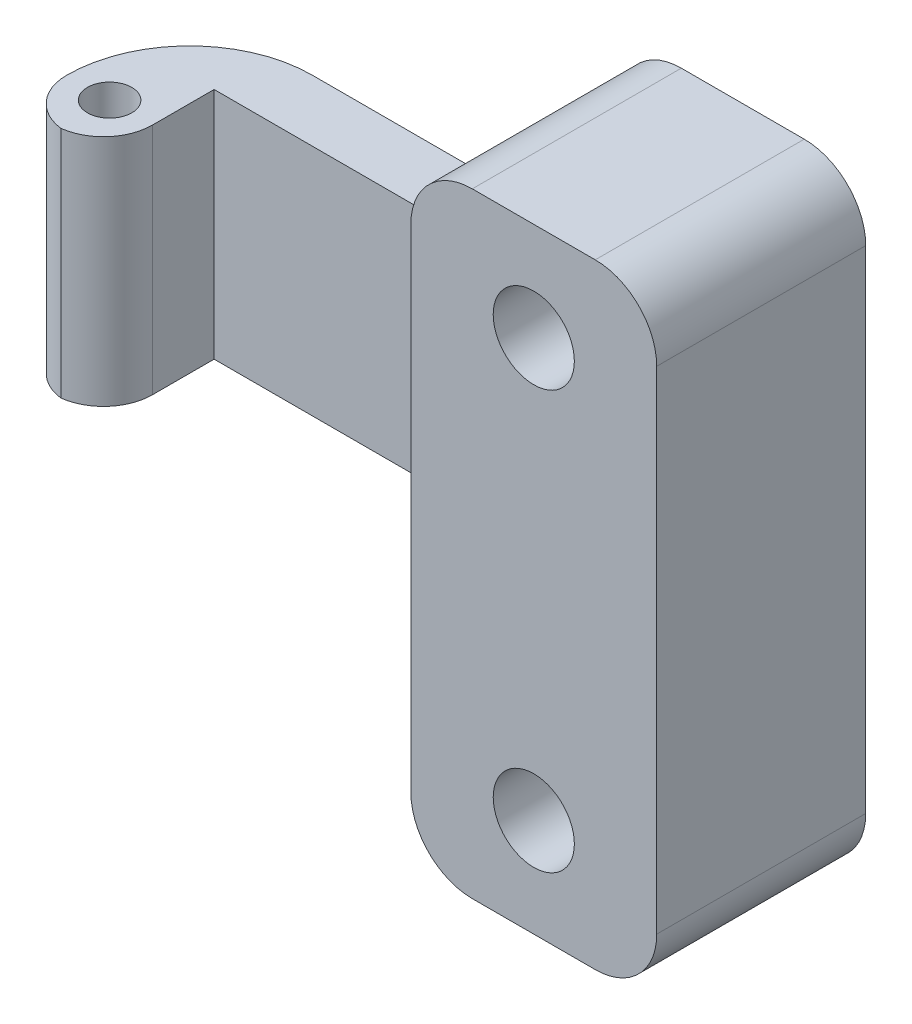
ISO-10303-21;
HEADER;
FILE_DESCRIPTION(('STEP AP214'),'2;1');
FILE_NAME('part.step','',(''),(''),'','','');
FILE_SCHEMA(('AUTOMOTIVE_DESIGN { 1 0 10303 214 1 1 1 1 }'));
ENDSEC;
DATA;
#1=APPLICATION_CONTEXT('core data for automotive mechanical design processes');
#2=APPLICATION_PROTOCOL_DEFINITION('international standard','automotive_design',2000,#1);
#3=PRODUCT_CONTEXT('',#1,'mechanical');
#4=PRODUCT('Part','Part','',(#3));
#5=PRODUCT_RELATED_PRODUCT_CATEGORY('part','',(#4));
#6=PRODUCT_DEFINITION_FORMATION('','',#4);
#7=PRODUCT_DEFINITION_CONTEXT('part definition',#1,'design');
#8=PRODUCT_DEFINITION('design','',#6,#7);
#9=PRODUCT_DEFINITION_SHAPE('','',#8);
#10=(LENGTH_UNIT() NAMED_UNIT(*) SI_UNIT(.MILLI.,.METRE.));
#11=(NAMED_UNIT(*) PLANE_ANGLE_UNIT() SI_UNIT($,.RADIAN.));
#12=(NAMED_UNIT(*) SI_UNIT($,.STERADIAN.) SOLID_ANGLE_UNIT());
#13=UNCERTAINTY_MEASURE_WITH_UNIT(LENGTH_MEASURE(1.E-05),#10,'distance_accuracy_value','');
#14=(GEOMETRIC_REPRESENTATION_CONTEXT(3) GLOBAL_UNCERTAINTY_ASSIGNED_CONTEXT((#13)) GLOBAL_UNIT_ASSIGNED_CONTEXT((#10,
#11,#12)) REPRESENTATION_CONTEXT('',''));
#15=CARTESIAN_POINT('',(0.,0.,0.));
#16=DIRECTION('',(0.,0.,1.));
#17=DIRECTION('',(1.,0.,0.));
#18=AXIS2_PLACEMENT_3D('',#15,#16,#17);
#19=CARTESIAN_POINT('',(0.,0.,5.));
#20=DIRECTION('',(0.,0.,1.));
#21=DIRECTION('',(1.,0.,0.));
#22=AXIS2_PLACEMENT_3D('',#19,#20,#21);
#23=PLANE('',#22);
#24=DIRECTION('',(1.,0.,0.));
#25=VECTOR('',#24,1.);
#26=CARTESIAN_POINT('',(0.,-9.5,5.));
#27=LINE('',#26,#25);
#28=CARTESIAN_POINT('',(-10.5,-9.5,5.));
#29=VERTEX_POINT('',#28);
#30=CARTESIAN_POINT('',(14.5,-9.5,5.));
#31=VERTEX_POINT('',#30);
#32=EDGE_CURVE('E175',#29,#31,#27,.T.);
#33=ORIENTED_EDGE('',*,*,#32,.T.);
#34=CARTESIAN_POINT('',(14.5,-12.5,5.));
#35=DIRECTION('',(0.,0.,1.));
#36=DIRECTION('',(1.,0.,0.));
#37=AXIS2_PLACEMENT_3D('',#34,#35,#36);
#38=CIRCLE('',#37,3.);
#39=CARTESIAN_POINT('',(17.5,-12.5,5.));
#40=VERTEX_POINT('',#39);
#41=EDGE_CURVE('E287',#31,#40,#38,.F.);
#42=ORIENTED_EDGE('',*,*,#41,.T.);
#43=DIRECTION('',(0.,1.,0.));
#44=VECTOR('',#43,1.);
#45=CARTESIAN_POINT('',(17.5,0.,5.));
#46=LINE('',#45,#44);
#47=CARTESIAN_POINT('',(17.5,12.5,5.));
#48=VERTEX_POINT('',#47);
#49=EDGE_CURVE('E211',#40,#48,#46,.T.);
#50=ORIENTED_EDGE('',*,*,#49,.T.);
#51=CARTESIAN_POINT('',(14.5,12.5,5.));
#52=DIRECTION('',(0.,0.,1.));
#53=DIRECTION('',(1.,0.,0.));
#54=AXIS2_PLACEMENT_3D('',#51,#52,#53);
#55=CIRCLE('',#54,3.);
#56=CARTESIAN_POINT('',(14.5,9.5,5.));
#57=VERTEX_POINT('',#56);
#58=EDGE_CURVE('E11',#48,#57,#55,.F.);
#59=ORIENTED_EDGE('',*,*,#58,.T.);
#60=DIRECTION('',(1.,0.,0.));
#61=VECTOR('',#60,1.);
#62=CARTESIAN_POINT('',(0.,9.5,5.));
#63=LINE('',#62,#61);
#64=CARTESIAN_POINT('',(-10.5,9.5,5.));
#65=VERTEX_POINT('',#64);
#66=EDGE_CURVE('E162',#65,#57,#63,.T.);
#67=ORIENTED_EDGE('',*,*,#66,.F.);
#68=DIRECTION('',(0.,1.,0.));
#69=VECTOR('',#68,1.);
#70=CARTESIAN_POINT('',(-10.5,9.5,5.));
#71=LINE('',#70,#69);
#72=EDGE_CURVE('E169',#29,#65,#71,.T.);
#73=ORIENTED_EDGE('',*,*,#72,.F.);
#74=EDGE_LOOP('',(#33,#42,#50,#59,#67,#73));
#75=FACE_BOUND('',#74,.T.);
#76=ADVANCED_FACE('F37',(#75),#23,.T.);
#77=CARTESIAN_POINT('',(0.,-9.5,5.));
#78=DIRECTION('',(0.,1.,0.));
#79=DIRECTION('',(0.,0.,1.));
#80=AXIS2_PLACEMENT_3D('',#77,#78,#79);
#81=PLANE('',#80);
#82=CARTESIAN_POINT('',(-14.,-9.5,10.));
#83=DIRECTION('',(0.,-1.,0.));
#84=DIRECTION('',(0.,0.,-1.));
#85=AXIS2_PLACEMENT_3D('',#82,#83,#84);
#86=CIRCLE('',#85,1.8);
#87=CARTESIAN_POINT('',(-14.,-9.5,8.2));
#88=VERTEX_POINT('',#87);
#89=EDGE_CURVE('E182',#88,#88,#86,.T.);
#90=ORIENTED_EDGE('',*,*,#89,.F.);
#91=EDGE_LOOP('',(#90));
#92=FACE_BOUND('',#91,.T.);
#93=DIRECTION('',(1.,0.,0.));
#94=VECTOR('',#93,1.);
#95=CARTESIAN_POINT('',(0.,-9.5,0.));
#96=LINE('',#95,#94);
#97=CARTESIAN_POINT('',(-7.49999999999999,-9.5,0.));
#98=VERTEX_POINT('',#97);
#99=CARTESIAN_POINT('',(14.5,-9.5,0.));
#100=VERTEX_POINT('',#99);
#101=EDGE_CURVE('E187',#98,#100,#96,.T.);
#102=ORIENTED_EDGE('',*,*,#101,.T.);
#103=DIRECTION('',(0.,0.,-1.));
#104=VECTOR('',#103,1.);
#105=CARTESIAN_POINT('',(14.5,-9.5,5.));
#106=LINE('',#105,#104);
#107=EDGE_CURVE('E281',#100,#31,#106,.F.);
#108=ORIENTED_EDGE('',*,*,#107,.T.);
#109=ORIENTED_EDGE('',*,*,#32,.F.);
#110=DIRECTION('',(0.,0.,-1.));
#111=VECTOR('',#110,1.);
#112=CARTESIAN_POINT('',(-10.5,-9.5,14.));
#113=LINE('',#112,#111);
#114=CARTESIAN_POINT('',(-10.5,-9.5,10.01));
#115=VERTEX_POINT('',#114);
#116=EDGE_CURVE('E168',#115,#29,#113,.T.);
#117=ORIENTED_EDGE('',*,*,#116,.F.);
#118=CARTESIAN_POINT('',(-14.49,-9.5,10.01));
#119=DIRECTION('',(0.,1.,0.));
#120=DIRECTION('',(0.,0.,1.));
#121=AXIS2_PLACEMENT_3D('',#118,#119,#120);
#122=CIRCLE('',#121,3.99);
#123=CARTESIAN_POINT('',(-14.,-9.5,13.9697979746447));
#124=VERTEX_POINT('',#123);
#125=EDGE_CURVE('E213',#115,#124,#122,.F.);
#126=ORIENTED_EDGE('',*,*,#125,.T.);
#127=CARTESIAN_POINT('',(-13.51,-9.5,10.01));
#128=DIRECTION('',(0.,1.,0.));
#129=DIRECTION('',(0.,0.,1.));
#130=AXIS2_PLACEMENT_3D('',#127,#128,#129);
#131=CIRCLE('',#130,3.99);
#132=CARTESIAN_POINT('',(-17.5,-9.5,10.01));
#133=VERTEX_POINT('',#132);
#134=EDGE_CURVE('E215',#124,#133,#131,.F.);
#135=ORIENTED_EDGE('',*,*,#134,.T.);
#136=DIRECTION('',(0.,0.,-1.));
#137=VECTOR('',#136,1.);
#138=CARTESIAN_POINT('',(-17.5,-9.5,5.));
#139=LINE('',#138,#137);
#140=CARTESIAN_POINT('',(-17.5,-9.5,10.));
#141=VERTEX_POINT('',#140);
#142=EDGE_CURVE('E174',#133,#141,#139,.T.);
#143=ORIENTED_EDGE('',*,*,#142,.T.);
#144=CARTESIAN_POINT('',(-7.49999999999999,-9.5,10.));
#145=DIRECTION('',(0.,1.,0.));
#146=DIRECTION('',(0.,0.,1.));
#147=AXIS2_PLACEMENT_3D('',#144,#145,#146);
#148=CIRCLE('',#147,10.);
#149=EDGE_CURVE('E232',#141,#98,#148,.F.);
#150=ORIENTED_EDGE('',*,*,#149,.T.);
#151=EDGE_LOOP('',(#102,#108,#109,#117,#126,#135,#143,#150));
#152=FACE_BOUND('',#151,.T.);
#153=ADVANCED_FACE('F309',(#92,#152),#81,.F.);
#154=CARTESIAN_POINT('',(0.,-25.,5.));
#155=DIRECTION('',(0.,-1.,0.));
#156=DIRECTION('',(1.,0.,0.));
#157=AXIS2_PLACEMENT_3D('',#154,#155,#156);
#158=PLANE('',#157);
#159=DIRECTION('',(-1.,0.,0.));
#160=VECTOR('',#159,1.);
#161=CARTESIAN_POINT('',(0.,-25.,0.));
#162=LINE('',#161,#160);
#163=CARTESIAN_POINT('',(32.5,-25.,0.));
#164=VERTEX_POINT('',#163);
#165=CARTESIAN_POINT('',(22.5,-25.,0.));
#166=VERTEX_POINT('',#165);
#167=EDGE_CURVE('E194',#164,#166,#162,.T.);
#168=ORIENTED_EDGE('',*,*,#167,.F.);
#169=DIRECTION('',(0.,0.,-1.));
#170=VECTOR('',#169,1.);
#171=CARTESIAN_POINT('',(32.5,-25.,5.));
#172=LINE('',#171,#170);
#173=CARTESIAN_POINT('',(32.5,-25.,17.));
#174=VERTEX_POINT('',#173);
#175=EDGE_CURVE('E273',#164,#174,#172,.F.);
#176=ORIENTED_EDGE('',*,*,#175,.T.);
#177=DIRECTION('',(1.,0.,0.));
#178=VECTOR('',#177,1.);
#179=CARTESIAN_POINT('',(17.5,-25.,17.));
#180=LINE('',#179,#178);
#181=CARTESIAN_POINT('',(22.5,-25.,17.));
#182=VERTEX_POINT('',#181);
#183=EDGE_CURVE('E338',#182,#174,#180,.T.);
#184=ORIENTED_EDGE('',*,*,#183,.F.);
#185=DIRECTION('',(0.,0.,-1.));
#186=VECTOR('',#185,1.);
#187=CARTESIAN_POINT('',(22.5,-25.,0.));
#188=LINE('',#187,#186);
#189=EDGE_CURVE('E270',#182,#166,#188,.T.);
#190=ORIENTED_EDGE('',*,*,#189,.T.);
#191=EDGE_LOOP('',(#168,#176,#184,#190));
#192=FACE_BOUND('',#191,.T.);
#193=ADVANCED_FACE('F358',(#192),#158,.T.);
#194=CARTESIAN_POINT('',(37.5,0.,5.));
#195=DIRECTION('',(1.,0.,0.));
#196=DIRECTION('',(0.,0.,-1.));
#197=AXIS2_PLACEMENT_3D('',#194,#195,#196);
#198=PLANE('',#197);
#199=DIRECTION('',(0.,-1.,0.));
#200=VECTOR('',#199,1.);
#201=CARTESIAN_POINT('',(37.5,0.,0.));
#202=LINE('',#201,#200);
#203=CARTESIAN_POINT('',(37.5,20.,0.));
#204=VERTEX_POINT('',#203);
#205=CARTESIAN_POINT('',(37.5,-20.,0.));
#206=VERTEX_POINT('',#205);
#207=EDGE_CURVE('E198',#204,#206,#202,.T.);
#208=ORIENTED_EDGE('',*,*,#207,.F.);
#209=DIRECTION('',(0.,0.,-1.));
#210=VECTOR('',#209,1.);
#211=CARTESIAN_POINT('',(37.5,20.,17.));
#212=LINE('',#211,#210);
#213=CARTESIAN_POINT('',(37.5,20.,17.));
#214=VERTEX_POINT('',#213);
#215=EDGE_CURVE('E268',#204,#214,#212,.F.);
#216=ORIENTED_EDGE('',*,*,#215,.T.);
#217=DIRECTION('',(0.,1.,0.));
#218=VECTOR('',#217,1.);
#219=CARTESIAN_POINT('',(37.5,25.,17.));
#220=LINE('',#219,#218);
#221=CARTESIAN_POINT('',(37.5,-20.,17.));
#222=VERTEX_POINT('',#221);
#223=EDGE_CURVE('E341',#222,#214,#220,.T.);
#224=ORIENTED_EDGE('',*,*,#223,.F.);
#225=DIRECTION('',(0.,0.,-1.));
#226=VECTOR('',#225,1.);
#227=CARTESIAN_POINT('',(37.5,-20.,5.));
#228=LINE('',#227,#226);
#229=EDGE_CURVE('E265',#222,#206,#228,.T.);
#230=ORIENTED_EDGE('',*,*,#229,.T.);
#231=EDGE_LOOP('',(#208,#216,#224,#230));
#232=FACE_BOUND('',#231,.T.);
#233=ADVANCED_FACE('F365',(#232),#198,.T.);
#234=CARTESIAN_POINT('',(0.,25.,5.));
#235=DIRECTION('',(0.,-1.,0.));
#236=DIRECTION('',(1.,0.,0.));
#237=AXIS2_PLACEMENT_3D('',#234,#235,#236);
#238=PLANE('',#237);
#239=DIRECTION('',(-1.,0.,0.));
#240=VECTOR('',#239,1.);
#241=CARTESIAN_POINT('',(0.,25.,0.));
#242=LINE('',#241,#240);
#243=CARTESIAN_POINT('',(32.5,25.,0.));
#244=VERTEX_POINT('',#243);
#245=CARTESIAN_POINT('',(22.5,25.,0.));
#246=VERTEX_POINT('',#245);
#247=EDGE_CURVE('E201',#244,#246,#242,.T.);
#248=ORIENTED_EDGE('',*,*,#247,.T.);
#249=DIRECTION('',(0.,0.,-1.));
#250=VECTOR('',#249,1.);
#251=CARTESIAN_POINT('',(22.5,25.,5.));
#252=LINE('',#251,#250);
#253=CARTESIAN_POINT('',(22.5,25.,17.));
#254=VERTEX_POINT('',#253);
#255=EDGE_CURVE('E255',#246,#254,#252,.F.);
#256=ORIENTED_EDGE('',*,*,#255,.T.);
#257=DIRECTION('',(-1.,0.,0.));
#258=VECTOR('',#257,1.);
#259=CARTESIAN_POINT('',(17.5,25.,17.));
#260=LINE('',#259,#258);
#261=CARTESIAN_POINT('',(32.5,25.,17.));
#262=VERTEX_POINT('',#261);
#263=EDGE_CURVE('E350',#262,#254,#260,.T.);
#264=ORIENTED_EDGE('',*,*,#263,.F.);
#265=DIRECTION('',(0.,0.,-1.));
#266=VECTOR('',#265,1.);
#267=CARTESIAN_POINT('',(32.5,25.,0.));
#268=LINE('',#267,#266);
#269=EDGE_CURVE('E252',#262,#244,#268,.T.);
#270=ORIENTED_EDGE('',*,*,#269,.T.);
#271=EDGE_LOOP('',(#248,#256,#264,#270));
#272=FACE_BOUND('',#271,.T.);
#273=ADVANCED_FACE('F426',(#272),#238,.F.);
#274=CARTESIAN_POINT('',(17.5,0.,5.));
#275=DIRECTION('',(1.,0.,0.));
#276=DIRECTION('',(0.,0.,-1.));
#277=AXIS2_PLACEMENT_3D('',#274,#275,#276);
#278=PLANE('',#277);
#279=ORIENTED_EDGE('',*,*,#49,.F.);
#280=DIRECTION('',(0.,0.,-1.));
#281=VECTOR('',#280,1.);
#282=CARTESIAN_POINT('',(17.5,-12.5,0.));
#283=LINE('',#282,#281);
#284=CARTESIAN_POINT('',(17.5,-12.5,0.));
#285=VERTEX_POINT('',#284);
#286=EDGE_CURVE('E278',#40,#285,#283,.T.);
#287=ORIENTED_EDGE('',*,*,#286,.T.);
#288=DIRECTION('',(0.,-1.,0.));
#289=VECTOR('',#288,1.);
#290=CARTESIAN_POINT('',(17.5,0.,0.));
#291=LINE('',#290,#289);
#292=CARTESIAN_POINT('',(17.5,-20.,0.));
#293=VERTEX_POINT('',#292);
#294=EDGE_CURVE('E192',#285,#293,#291,.T.);
#295=ORIENTED_EDGE('',*,*,#294,.T.);
#296=DIRECTION('',(0.,0.,-1.));
#297=VECTOR('',#296,1.);
#298=CARTESIAN_POINT('',(17.5,-20.,17.));
#299=LINE('',#298,#297);
#300=CARTESIAN_POINT('',(17.5,-20.,17.));
#301=VERTEX_POINT('',#300);
#302=EDGE_CURVE('E238',#293,#301,#299,.F.);
#303=ORIENTED_EDGE('',*,*,#302,.T.);
#304=DIRECTION('',(0.,-1.,0.));
#305=VECTOR('',#304,1.);
#306=CARTESIAN_POINT('',(17.5,25.,17.));
#307=LINE('',#306,#305);
#308=CARTESIAN_POINT('',(17.5,20.,17.));
#309=VERTEX_POINT('',#308);
#310=EDGE_CURVE('E331',#309,#301,#307,.T.);
#311=ORIENTED_EDGE('',*,*,#310,.F.);
#312=DIRECTION('',(0.,0.,-1.));
#313=VECTOR('',#312,1.);
#314=CARTESIAN_POINT('',(17.5,20.,5.));
#315=LINE('',#314,#313);
#316=CARTESIAN_POINT('',(17.5,20.,0.));
#317=VERTEX_POINT('',#316);
#318=EDGE_CURVE('E240',#309,#317,#315,.T.);
#319=ORIENTED_EDGE('',*,*,#318,.T.);
#320=CARTESIAN_POINT('',(17.5,12.5,0.));
#321=VERTEX_POINT('',#320);
#322=EDGE_CURVE('E195',#317,#321,#291,.T.);
#323=ORIENTED_EDGE('',*,*,#322,.T.);
#324=DIRECTION('',(0.,0.,-1.));
#325=VECTOR('',#324,1.);
#326=CARTESIAN_POINT('',(17.5,12.5,5.));
#327=LINE('',#326,#325);
#328=EDGE_CURVE('E275',#321,#48,#327,.F.);
#329=ORIENTED_EDGE('',*,*,#328,.T.);
#330=EDGE_LOOP('',(#279,#287,#295,#303,#311,#319,#323,#329));
#331=FACE_BOUND('',#330,.T.);
#332=ADVANCED_FACE('F295',(#331),#278,.F.);
#333=CARTESIAN_POINT('',(0.,9.5,5.));
#334=DIRECTION('',(0.,1.,0.));
#335=DIRECTION('',(0.,0.,1.));
#336=AXIS2_PLACEMENT_3D('',#333,#334,#335);
#337=PLANE('',#336);
#338=CARTESIAN_POINT('',(-14.,9.5,10.));
#339=DIRECTION('',(0.,1.,0.));
#340=DIRECTION('',(0.,0.,1.));
#341=AXIS2_PLACEMENT_3D('',#338,#339,#340);
#342=CIRCLE('',#341,1.8);
#343=CARTESIAN_POINT('',(-14.,9.5,11.8));
#344=VERTEX_POINT('',#343);
#345=EDGE_CURVE('E179',#344,#344,#342,.T.);
#346=ORIENTED_EDGE('',*,*,#345,.F.);
#347=EDGE_LOOP('',(#346));
#348=FACE_BOUND('',#347,.T.);
#349=ORIENTED_EDGE('',*,*,#66,.T.);
#350=DIRECTION('',(0.,0.,-1.));
#351=VECTOR('',#350,1.);
#352=CARTESIAN_POINT('',(14.5,9.5,5.));
#353=LINE('',#352,#351);
#354=CARTESIAN_POINT('',(14.5,9.5,0.));
#355=VERTEX_POINT('',#354);
#356=EDGE_CURVE('E283',#57,#355,#353,.T.);
#357=ORIENTED_EDGE('',*,*,#356,.T.);
#358=DIRECTION('',(1.,0.,0.));
#359=VECTOR('',#358,1.);
#360=CARTESIAN_POINT('',(0.,9.5,0.));
#361=LINE('',#360,#359);
#362=CARTESIAN_POINT('',(-7.5,9.5,0.));
#363=VERTEX_POINT('',#362);
#364=EDGE_CURVE('E188',#363,#355,#361,.T.);
#365=ORIENTED_EDGE('',*,*,#364,.F.);
#366=CARTESIAN_POINT('',(-7.5,9.5,10.));
#367=DIRECTION('',(0.,1.,0.));
#368=DIRECTION('',(0.,0.,1.));
#369=AXIS2_PLACEMENT_3D('',#366,#367,#368);
#370=CIRCLE('',#369,10.);
#371=CARTESIAN_POINT('',(-17.5,9.5,10.));
#372=VERTEX_POINT('',#371);
#373=EDGE_CURVE('E236',#363,#372,#370,.T.);
#374=ORIENTED_EDGE('',*,*,#373,.T.);
#375=DIRECTION('',(0.,0.,-1.));
#376=VECTOR('',#375,1.);
#377=CARTESIAN_POINT('',(-17.5,9.5,5.));
#378=LINE('',#377,#376);
#379=CARTESIAN_POINT('',(-17.5,9.5,10.01));
#380=VERTEX_POINT('',#379);
#381=EDGE_CURVE('E208',#380,#372,#378,.T.);
#382=ORIENTED_EDGE('',*,*,#381,.F.);
#383=CARTESIAN_POINT('',(-13.51,9.5,10.01));
#384=DIRECTION('',(0.,1.,0.));
#385=DIRECTION('',(0.,0.,1.));
#386=AXIS2_PLACEMENT_3D('',#383,#384,#385);
#387=CIRCLE('',#386,3.99);
#388=CARTESIAN_POINT('',(-14.,9.5,13.9697979746447));
#389=VERTEX_POINT('',#388);
#390=EDGE_CURVE('E221',#380,#389,#387,.T.);
#391=ORIENTED_EDGE('',*,*,#390,.T.);
#392=CARTESIAN_POINT('',(-14.49,9.5,10.01));
#393=DIRECTION('',(0.,1.,0.));
#394=DIRECTION('',(0.,0.,1.));
#395=AXIS2_PLACEMENT_3D('',#392,#393,#394);
#396=CIRCLE('',#395,3.99);
#397=CARTESIAN_POINT('',(-10.5,9.5,10.01));
#398=VERTEX_POINT('',#397);
#399=EDGE_CURVE('E164',#389,#398,#396,.T.);
#400=ORIENTED_EDGE('',*,*,#399,.T.);
#401=DIRECTION('',(0.,0.,-1.));
#402=VECTOR('',#401,1.);
#403=CARTESIAN_POINT('',(-10.5,9.5,14.));
#404=LINE('',#403,#402);
#405=EDGE_CURVE('E160',#398,#65,#404,.T.);
#406=ORIENTED_EDGE('',*,*,#405,.T.);
#407=EDGE_LOOP('',(#349,#357,#365,#374,#382,#391,#400,#406));
#408=FACE_BOUND('',#407,.T.);
#409=ADVANCED_FACE('F161',(#348,#408),#337,.T.);
#410=CARTESIAN_POINT('',(-17.5,0.,5.));
#411=DIRECTION('',(1.,0.,0.));
#412=DIRECTION('',(0.,1.,0.));
#413=AXIS2_PLACEMENT_3D('',#410,#411,#412);
#414=PLANE('',#413);
#415=ORIENTED_EDGE('',*,*,#381,.T.);
#416=DIRECTION('',(0.,-1.,0.));
#417=VECTOR('',#416,1.);
#418=CARTESIAN_POINT('',(-17.5,0.,10.));
#419=LINE('',#418,#417);
#420=EDGE_CURVE('E225',#372,#141,#419,.T.);
#421=ORIENTED_EDGE('',*,*,#420,.T.);
#422=ORIENTED_EDGE('',*,*,#142,.F.);
#423=DIRECTION('',(0.,-1.,0.));
#424=VECTOR('',#423,1.);
#425=CARTESIAN_POINT('',(-17.5,9.5,10.01));
#426=LINE('',#425,#424);
#427=EDGE_CURVE('E217',#133,#380,#426,.F.);
#428=ORIENTED_EDGE('',*,*,#427,.T.);
#429=EDGE_LOOP('',(#415,#421,#422,#428));
#430=FACE_BOUND('',#429,.T.);
#431=ADVANCED_FACE('F306',(#430),#414,.F.);
#432=CARTESIAN_POINT('',(0.,0.,0.));
#433=DIRECTION('',(0.,0.,1.));
#434=DIRECTION('',(1.,0.,0.));
#435=AXIS2_PLACEMENT_3D('',#432,#433,#434);
#436=PLANE('',#435);
#437=CARTESIAN_POINT('',(27.5,17.,0.));
#438=DIRECTION('',(0.,0.,-1.));
#439=DIRECTION('',(-1.,0.,0.));
#440=AXIS2_PLACEMENT_3D('',#437,#438,#439);
#441=CIRCLE('',#440,5.49999999999999);
#442=CARTESIAN_POINT('',(22.,17.,0.));
#443=VERTEX_POINT('',#442);
#444=EDGE_CURVE('E229',#443,#443,#441,.T.);
#445=ORIENTED_EDGE('',*,*,#444,.F.);
#446=EDGE_LOOP('',(#445));
#447=FACE_BOUND('',#446,.T.);
#448=CARTESIAN_POINT('',(27.5,-17.,0.));
#449=DIRECTION('',(0.,0.,-1.));
#450=DIRECTION('',(-1.,0.,0.));
#451=AXIS2_PLACEMENT_3D('',#448,#449,#450);
#452=CIRCLE('',#451,5.5);
#453=CARTESIAN_POINT('',(22.,-17.,0.));
#454=VERTEX_POINT('',#453);
#455=EDGE_CURVE('E714',#454,#454,#452,.T.);
#456=ORIENTED_EDGE('',*,*,#455,.F.);
#457=EDGE_LOOP('',(#456));
#458=FACE_BOUND('',#457,.T.);
#459=ORIENTED_EDGE('',*,*,#322,.F.);
#460=CARTESIAN_POINT('',(22.5,20.,0.));
#461=DIRECTION('',(0.,0.,1.));
#462=DIRECTION('',(1.,0.,0.));
#463=AXIS2_PLACEMENT_3D('',#460,#461,#462);
#464=CIRCLE('',#463,5.);
#465=EDGE_CURVE('E250',#317,#246,#464,.F.);
#466=ORIENTED_EDGE('',*,*,#465,.T.);
#467=ORIENTED_EDGE('',*,*,#247,.F.);
#468=CARTESIAN_POINT('',(32.5,20.,0.));
#469=DIRECTION('',(0.,0.,1.));
#470=DIRECTION('',(1.,0.,0.));
#471=AXIS2_PLACEMENT_3D('',#468,#469,#470);
#472=CIRCLE('',#471,5.);
#473=EDGE_CURVE('E248',#244,#204,#472,.F.);
#474=ORIENTED_EDGE('',*,*,#473,.T.);
#475=ORIENTED_EDGE('',*,*,#207,.T.);
#476=CARTESIAN_POINT('',(32.5,-20.,0.));
#477=DIRECTION('',(0.,0.,1.));
#478=DIRECTION('',(1.,0.,0.));
#479=AXIS2_PLACEMENT_3D('',#476,#477,#478);
#480=CIRCLE('',#479,5.);
#481=EDGE_CURVE('E246',#206,#164,#480,.F.);
#482=ORIENTED_EDGE('',*,*,#481,.T.);
#483=ORIENTED_EDGE('',*,*,#167,.T.);
#484=CARTESIAN_POINT('',(22.5,-20.,0.));
#485=DIRECTION('',(0.,0.,1.));
#486=DIRECTION('',(1.,0.,0.));
#487=AXIS2_PLACEMENT_3D('',#484,#485,#486);
#488=CIRCLE('',#487,5.);
#489=EDGE_CURVE('E243',#166,#293,#488,.F.);
#490=ORIENTED_EDGE('',*,*,#489,.T.);
#491=ORIENTED_EDGE('',*,*,#294,.F.);
#492=CARTESIAN_POINT('',(14.5,-12.5,0.));
#493=DIRECTION('',(0.,0.,1.));
#494=DIRECTION('',(1.,0.,0.));
#495=AXIS2_PLACEMENT_3D('',#492,#493,#494);
#496=CIRCLE('',#495,3.);
#497=EDGE_CURVE('E285',#285,#100,#496,.T.);
#498=ORIENTED_EDGE('',*,*,#497,.T.);
#499=ORIENTED_EDGE('',*,*,#101,.F.);
#500=DIRECTION('',(0.,-1.,0.));
#501=VECTOR('',#500,1.);
#502=CARTESIAN_POINT('',(-7.5,0.,0.));
#503=LINE('',#502,#501);
#504=EDGE_CURVE('E234',#98,#363,#503,.F.);
#505=ORIENTED_EDGE('',*,*,#504,.T.);
#506=ORIENTED_EDGE('',*,*,#364,.T.);
#507=CARTESIAN_POINT('',(14.5,12.5,0.));
#508=DIRECTION('',(0.,0.,1.));
#509=DIRECTION('',(1.,0.,0.));
#510=AXIS2_PLACEMENT_3D('',#507,#508,#509);
#511=CIRCLE('',#510,3.);
#512=EDGE_CURVE('E45',#355,#321,#511,.T.);
#513=ORIENTED_EDGE('',*,*,#512,.T.);
#514=EDGE_LOOP('',(#459,#466,#467,#474,#475,#482,#483,#490,#491,#498,#499,#505,#506,#513));
#515=FACE_BOUND('',#514,.T.);
#516=ADVANCED_FACE('F292',(#447,#458,#515),#436,.F.);
#517=CARTESIAN_POINT('',(-10.5,9.5,14.));
#518=DIRECTION('',(-1.,0.,0.));
#519=DIRECTION('',(0.,-1.,0.));
#520=AXIS2_PLACEMENT_3D('',#517,#518,#519);
#521=PLANE('',#520);
#522=ORIENTED_EDGE('',*,*,#405,.F.);
#523=DIRECTION('',(0.,1.,0.));
#524=VECTOR('',#523,1.);
#525=CARTESIAN_POINT('',(-10.5,-9.5,10.01));
#526=LINE('',#525,#524);
#527=EDGE_CURVE('E223',#398,#115,#526,.F.);
#528=ORIENTED_EDGE('',*,*,#527,.T.);
#529=ORIENTED_EDGE('',*,*,#116,.T.);
#530=ORIENTED_EDGE('',*,*,#72,.T.);
#531=EDGE_LOOP('',(#522,#528,#529,#530));
#532=FACE_BOUND('',#531,.T.);
#533=ADVANCED_FACE('F177',(#532),#521,.F.);
#534=CARTESIAN_POINT('',(-14.,-9.5,10.));
#535=DIRECTION('',(0.,-1.,0.));
#536=DIRECTION('',(0.,0.,-1.));
#537=AXIS2_PLACEMENT_3D('',#534,#535,#536);
#538=CYLINDRICAL_SURFACE('',#537,1.8);
#539=ORIENTED_EDGE('',*,*,#89,.T.);
#540=EDGE_LOOP('',(#539));
#541=FACE_BOUND('',#540,.T.);
#542=ORIENTED_EDGE('',*,*,#345,.T.);
#543=EDGE_LOOP('',(#542));
#544=FACE_BOUND('',#543,.T.);
#545=ADVANCED_FACE('F354',(#541,#544),#538,.F.);
#546=CARTESIAN_POINT('',(0.,0.,17.));
#547=DIRECTION('',(0.,0.,1.));
#548=DIRECTION('',(1.,0.,0.));
#549=AXIS2_PLACEMENT_3D('',#546,#547,#548);
#550=PLANE('',#549);
#551=CARTESIAN_POINT('',(27.5,17.,17.));
#552=DIRECTION('',(0.,0.,1.));
#553=DIRECTION('',(1.,0.,0.));
#554=AXIS2_PLACEMENT_3D('',#551,#552,#553);
#555=CIRCLE('',#554,3.3);
#556=CARTESIAN_POINT('',(30.8,17.,17.));
#557=VERTEX_POINT('',#556);
#558=EDGE_CURVE('E711',#557,#557,#555,.T.);
#559=ORIENTED_EDGE('',*,*,#558,.F.);
#560=EDGE_LOOP('',(#559));
#561=FACE_BOUND('',#560,.T.);
#562=CARTESIAN_POINT('',(27.5,-17.,17.));
#563=DIRECTION('',(0.,0.,1.));
#564=DIRECTION('',(1.,0.,0.));
#565=AXIS2_PLACEMENT_3D('',#562,#563,#564);
#566=CIRCLE('',#565,3.3);
#567=CARTESIAN_POINT('',(30.8,-17.,17.));
#568=VERTEX_POINT('',#567);
#569=EDGE_CURVE('E339',#568,#568,#566,.T.);
#570=ORIENTED_EDGE('',*,*,#569,.F.);
#571=EDGE_LOOP('',(#570));
#572=FACE_BOUND('',#571,.T.);
#573=ORIENTED_EDGE('',*,*,#263,.T.);
#574=CARTESIAN_POINT('',(22.5,20.,17.));
#575=DIRECTION('',(0.,0.,1.));
#576=DIRECTION('',(1.,0.,0.));
#577=AXIS2_PLACEMENT_3D('',#574,#575,#576);
#578=CIRCLE('',#577,5.);
#579=EDGE_CURVE('E263',#254,#309,#578,.T.);
#580=ORIENTED_EDGE('',*,*,#579,.T.);
#581=ORIENTED_EDGE('',*,*,#310,.T.);
#582=CARTESIAN_POINT('',(22.5,-20.,17.));
#583=DIRECTION('',(0.,0.,1.));
#584=DIRECTION('',(1.,0.,0.));
#585=AXIS2_PLACEMENT_3D('',#582,#583,#584);
#586=CIRCLE('',#585,5.);
#587=EDGE_CURVE('E257',#301,#182,#586,.T.);
#588=ORIENTED_EDGE('',*,*,#587,.T.);
#589=ORIENTED_EDGE('',*,*,#183,.T.);
#590=CARTESIAN_POINT('',(32.5,-20.,17.));
#591=DIRECTION('',(0.,0.,1.));
#592=DIRECTION('',(1.,0.,0.));
#593=AXIS2_PLACEMENT_3D('',#590,#591,#592);
#594=CIRCLE('',#593,5.);
#595=EDGE_CURVE('E259',#174,#222,#594,.T.);
#596=ORIENTED_EDGE('',*,*,#595,.T.);
#597=ORIENTED_EDGE('',*,*,#223,.T.);
#598=CARTESIAN_POINT('',(32.5,20.,17.));
#599=DIRECTION('',(0.,0.,1.));
#600=DIRECTION('',(1.,0.,0.));
#601=AXIS2_PLACEMENT_3D('',#598,#599,#600);
#602=CIRCLE('',#601,5.);
#603=EDGE_CURVE('E261',#214,#262,#602,.T.);
#604=ORIENTED_EDGE('',*,*,#603,.T.);
#605=EDGE_LOOP('',(#573,#580,#581,#588,#589,#596,#597,#604));
#606=FACE_BOUND('',#605,.T.);
#607=ADVANCED_FACE('F334',(#561,#572,#606),#550,.T.);
#608=CARTESIAN_POINT('',(27.5,-17.,0.));
#609=DIRECTION('',(0.,0.,-1.));
#610=DIRECTION('',(-1.,0.,0.));
#611=AXIS2_PLACEMENT_3D('',#608,#609,#610);
#612=CYLINDRICAL_SURFACE('',#611,3.3);
#613=CARTESIAN_POINT('',(27.5,-17.,6.4));
#614=DIRECTION('',(0.,0.,-1.));
#615=DIRECTION('',(-1.,0.,0.));
#616=AXIS2_PLACEMENT_3D('',#613,#614,#615);
#617=CIRCLE('',#616,3.3);
#618=CARTESIAN_POINT('',(24.2,-17.,6.4));
#619=VERTEX_POINT('',#618);
#620=EDGE_CURVE('E344',#619,#619,#617,.T.);
#621=ORIENTED_EDGE('',*,*,#620,.T.);
#622=EDGE_LOOP('',(#621));
#623=FACE_BOUND('',#622,.T.);
#624=ORIENTED_EDGE('',*,*,#569,.T.);
#625=EDGE_LOOP('',(#624));
#626=FACE_BOUND('',#625,.T.);
#627=ADVANCED_FACE('F443',(#623,#626),#612,.F.);
#628=CARTESIAN_POINT('',(30.8,-17.,6.4));
#629=DIRECTION('',(0.,0.,1.));
#630=DIRECTION('',(1.,0.,0.));
#631=AXIS2_PLACEMENT_3D('',#628,#629,#630);
#632=PLANE('',#631);
#633=ORIENTED_EDGE('',*,*,#620,.F.);
#634=EDGE_LOOP('',(#633));
#635=FACE_BOUND('',#634,.T.);
#636=CARTESIAN_POINT('',(27.5,-17.,6.4));
#637=DIRECTION('',(0.,0.,-1.));
#638=DIRECTION('',(-1.,0.,0.));
#639=AXIS2_PLACEMENT_3D('',#636,#637,#638);
#640=CIRCLE('',#639,5.5);
#641=CARTESIAN_POINT('',(22.,-17.,6.4));
#642=VERTEX_POINT('',#641);
#643=EDGE_CURVE('E717',#642,#642,#640,.T.);
#644=ORIENTED_EDGE('',*,*,#643,.T.);
#645=EDGE_LOOP('',(#644));
#646=FACE_BOUND('',#645,.T.);
#647=ADVANCED_FACE('F455',(#635,#646),#632,.F.);
#648=CARTESIAN_POINT('',(27.5,-17.,0.));
#649=DIRECTION('',(0.,0.,-1.));
#650=DIRECTION('',(-1.,0.,0.));
#651=AXIS2_PLACEMENT_3D('',#648,#649,#650);
#652=CYLINDRICAL_SURFACE('',#651,5.5);
#653=ORIENTED_EDGE('',*,*,#643,.F.);
#654=EDGE_LOOP('',(#653));
#655=FACE_BOUND('',#654,.T.);
#656=ORIENTED_EDGE('',*,*,#455,.T.);
#657=EDGE_LOOP('',(#656));
#658=FACE_BOUND('',#657,.T.);
#659=ADVANCED_FACE('F463',(#655,#658),#652,.F.);
#660=CARTESIAN_POINT('',(27.5,17.,0.));
#661=DIRECTION('',(0.,0.,-1.));
#662=DIRECTION('',(-1.,0.,0.));
#663=AXIS2_PLACEMENT_3D('',#660,#661,#662);
#664=CYLINDRICAL_SURFACE('',#663,3.3);
#665=CARTESIAN_POINT('',(27.5,17.,6.4));
#666=DIRECTION('',(0.,0.,-1.));
#667=DIRECTION('',(-1.,0.,0.));
#668=AXIS2_PLACEMENT_3D('',#665,#666,#667);
#669=CIRCLE('',#668,3.3);
#670=CARTESIAN_POINT('',(24.2,17.,6.4));
#671=VERTEX_POINT('',#670);
#672=EDGE_CURVE('E706',#671,#671,#669,.T.);
#673=ORIENTED_EDGE('',*,*,#672,.T.);
#674=EDGE_LOOP('',(#673));
#675=FACE_BOUND('',#674,.T.);
#676=ORIENTED_EDGE('',*,*,#558,.T.);
#677=EDGE_LOOP('',(#676));
#678=FACE_BOUND('',#677,.T.);
#679=ADVANCED_FACE('F471',(#675,#678),#664,.F.);
#680=CARTESIAN_POINT('',(30.8,17.,6.4));
#681=DIRECTION('',(0.,0.,1.));
#682=DIRECTION('',(1.,0.,0.));
#683=AXIS2_PLACEMENT_3D('',#680,#681,#682);
#684=PLANE('',#683);
#685=ORIENTED_EDGE('',*,*,#672,.F.);
#686=EDGE_LOOP('',(#685));
#687=FACE_BOUND('',#686,.T.);
#688=CARTESIAN_POINT('',(27.5,17.,6.4));
#689=DIRECTION('',(0.,0.,-1.));
#690=DIRECTION('',(-1.,0.,0.));
#691=AXIS2_PLACEMENT_3D('',#688,#689,#690);
#692=CIRCLE('',#691,5.49999999999999);
#693=CARTESIAN_POINT('',(22.,17.,6.4));
#694=VERTEX_POINT('',#693);
#695=EDGE_CURVE('E702',#694,#694,#692,.T.);
#696=ORIENTED_EDGE('',*,*,#695,.T.);
#697=EDGE_LOOP('',(#696));
#698=FACE_BOUND('',#697,.T.);
#699=ADVANCED_FACE('F479',(#687,#698),#684,.F.);
#700=CARTESIAN_POINT('',(27.5,17.,0.));
#701=DIRECTION('',(0.,0.,-1.));
#702=DIRECTION('',(-1.,0.,0.));
#703=AXIS2_PLACEMENT_3D('',#700,#701,#702);
#704=CYLINDRICAL_SURFACE('',#703,5.49999999999999);
#705=ORIENTED_EDGE('',*,*,#695,.F.);
#706=EDGE_LOOP('',(#705));
#707=FACE_BOUND('',#706,.T.);
#708=ORIENTED_EDGE('',*,*,#444,.T.);
#709=EDGE_LOOP('',(#708));
#710=FACE_BOUND('',#709,.T.);
#711=ADVANCED_FACE('F375',(#707,#710),#704,.F.);
#712=CARTESIAN_POINT('',(-14.49,0.,10.01));
#713=DIRECTION('',(0.,-1.,0.));
#714=DIRECTION('',(1.,0.,0.));
#715=AXIS2_PLACEMENT_3D('',#712,#713,#714);
#716=CYLINDRICAL_SURFACE('',#715,3.99);
#717=ORIENTED_EDGE('',*,*,#527,.F.);
#718=ORIENTED_EDGE('',*,*,#399,.F.);
#719=DIRECTION('',(0.,-1.,0.));
#720=VECTOR('',#719,1.);
#721=CARTESIAN_POINT('',(-14.,0.,13.9697979746447));
#722=LINE('',#721,#720);
#723=EDGE_CURVE('E226',#124,#389,#722,.F.);
#724=ORIENTED_EDGE('',*,*,#723,.F.);
#725=ORIENTED_EDGE('',*,*,#125,.F.);
#726=EDGE_LOOP('',(#717,#718,#724,#725));
#727=FACE_BOUND('',#726,.T.);
#728=ADVANCED_FACE('F317',(#727),#716,.T.);
#729=CARTESIAN_POINT('',(-13.51,0.,10.01));
#730=DIRECTION('',(0.,1.,0.));
#731=DIRECTION('',(-1.,0.,0.));
#732=AXIS2_PLACEMENT_3D('',#729,#730,#731);
#733=CYLINDRICAL_SURFACE('',#732,3.99);
#734=ORIENTED_EDGE('',*,*,#390,.F.);
#735=ORIENTED_EDGE('',*,*,#427,.F.);
#736=ORIENTED_EDGE('',*,*,#134,.F.);
#737=ORIENTED_EDGE('',*,*,#723,.T.);
#738=EDGE_LOOP('',(#734,#735,#736,#737));
#739=FACE_BOUND('',#738,.T.);
#740=ADVANCED_FACE('F315',(#739),#733,.T.);
#741=CARTESIAN_POINT('',(-7.5,0.,10.));
#742=DIRECTION('',(0.,-1.,0.));
#743=DIRECTION('',(1.,0.,0.));
#744=AXIS2_PLACEMENT_3D('',#741,#742,#743);
#745=CYLINDRICAL_SURFACE('',#744,10.);
#746=ORIENTED_EDGE('',*,*,#373,.F.);
#747=ORIENTED_EDGE('',*,*,#504,.F.);
#748=ORIENTED_EDGE('',*,*,#149,.F.);
#749=ORIENTED_EDGE('',*,*,#420,.F.);
#750=EDGE_LOOP('',(#746,#747,#748,#749));
#751=FACE_BOUND('',#750,.T.);
#752=ADVANCED_FACE('F303',(#751),#745,.T.);
#753=CARTESIAN_POINT('',(22.5,20.,5.));
#754=DIRECTION('',(0.,0.,-1.));
#755=DIRECTION('',(-1.,0.,0.));
#756=AXIS2_PLACEMENT_3D('',#753,#754,#755);
#757=CYLINDRICAL_SURFACE('',#756,5.);
#758=ORIENTED_EDGE('',*,*,#579,.F.);
#759=ORIENTED_EDGE('',*,*,#255,.F.);
#760=ORIENTED_EDGE('',*,*,#465,.F.);
#761=ORIENTED_EDGE('',*,*,#318,.F.);
#762=EDGE_LOOP('',(#758,#759,#760,#761));
#763=FACE_BOUND('',#762,.T.);
#764=ADVANCED_FACE('F378',(#763),#757,.T.);
#765=CARTESIAN_POINT('',(32.5,20.,5.));
#766=DIRECTION('',(0.,0.,1.));
#767=DIRECTION('',(1.,0.,0.));
#768=AXIS2_PLACEMENT_3D('',#765,#766,#767);
#769=CYLINDRICAL_SURFACE('',#768,5.);
#770=ORIENTED_EDGE('',*,*,#603,.F.);
#771=ORIENTED_EDGE('',*,*,#215,.F.);
#772=ORIENTED_EDGE('',*,*,#473,.F.);
#773=ORIENTED_EDGE('',*,*,#269,.F.);
#774=EDGE_LOOP('',(#770,#771,#772,#773));
#775=FACE_BOUND('',#774,.T.);
#776=ADVANCED_FACE('F381',(#775),#769,.T.);
#777=CARTESIAN_POINT('',(32.5,-20.,5.));
#778=DIRECTION('',(0.,0.,-1.));
#779=DIRECTION('',(-1.,0.,0.));
#780=AXIS2_PLACEMENT_3D('',#777,#778,#779);
#781=CYLINDRICAL_SURFACE('',#780,5.);
#782=ORIENTED_EDGE('',*,*,#595,.F.);
#783=ORIENTED_EDGE('',*,*,#175,.F.);
#784=ORIENTED_EDGE('',*,*,#481,.F.);
#785=ORIENTED_EDGE('',*,*,#229,.F.);
#786=EDGE_LOOP('',(#782,#783,#784,#785));
#787=FACE_BOUND('',#786,.T.);
#788=ADVANCED_FACE('F385',(#787),#781,.T.);
#789=CARTESIAN_POINT('',(22.5,-20.,5.));
#790=DIRECTION('',(0.,0.,1.));
#791=DIRECTION('',(1.,0.,0.));
#792=AXIS2_PLACEMENT_3D('',#789,#790,#791);
#793=CYLINDRICAL_SURFACE('',#792,5.);
#794=ORIENTED_EDGE('',*,*,#587,.F.);
#795=ORIENTED_EDGE('',*,*,#302,.F.);
#796=ORIENTED_EDGE('',*,*,#489,.F.);
#797=ORIENTED_EDGE('',*,*,#189,.F.);
#798=EDGE_LOOP('',(#794,#795,#796,#797));
#799=FACE_BOUND('',#798,.T.);
#800=ADVANCED_FACE('F329',(#799),#793,.T.);
#801=CARTESIAN_POINT('',(14.5,-12.5,5.));
#802=DIRECTION('',(0.,0.,1.));
#803=DIRECTION('',(1.,0.,0.));
#804=AXIS2_PLACEMENT_3D('',#801,#802,#803);
#805=CYLINDRICAL_SURFACE('',#804,3.);
#806=ORIENTED_EDGE('',*,*,#41,.F.);
#807=ORIENTED_EDGE('',*,*,#107,.F.);
#808=ORIENTED_EDGE('',*,*,#497,.F.);
#809=ORIENTED_EDGE('',*,*,#286,.F.);
#810=EDGE_LOOP('',(#806,#807,#808,#809));
#811=FACE_BOUND('',#810,.T.);
#812=ADVANCED_FACE('F322',(#811),#805,.F.);
#813=CARTESIAN_POINT('',(14.5,12.5,5.));
#814=DIRECTION('',(0.,0.,-1.));
#815=DIRECTION('',(-1.,0.,0.));
#816=AXIS2_PLACEMENT_3D('',#813,#814,#815);
#817=CYLINDRICAL_SURFACE('',#816,3.);
#818=ORIENTED_EDGE('',*,*,#58,.F.);
#819=ORIENTED_EDGE('',*,*,#328,.F.);
#820=ORIENTED_EDGE('',*,*,#512,.F.);
#821=ORIENTED_EDGE('',*,*,#356,.F.);
#822=EDGE_LOOP('',(#818,#819,#820,#821));
#823=FACE_BOUND('',#822,.T.);
#824=ADVANCED_FACE('F39',(#823),#817,.F.);
#825=CLOSED_SHELL('',(#76,#153,#193,#233,#273,#332,#409,#431,#516,#533,#545,#607,#627,#647,#659,
#679,#699,#711,#728,#740,#752,#764,#776,#788,#800,#812,#824));
#826=MANIFOLD_SOLID_BREP('B2',#825);
#827=ADVANCED_BREP_SHAPE_REPRESENTATION('',(#18,#826),#14);
#828=SHAPE_DEFINITION_REPRESENTATION(#9,#827);
ENDSEC;
END-ISO-10303-21;
